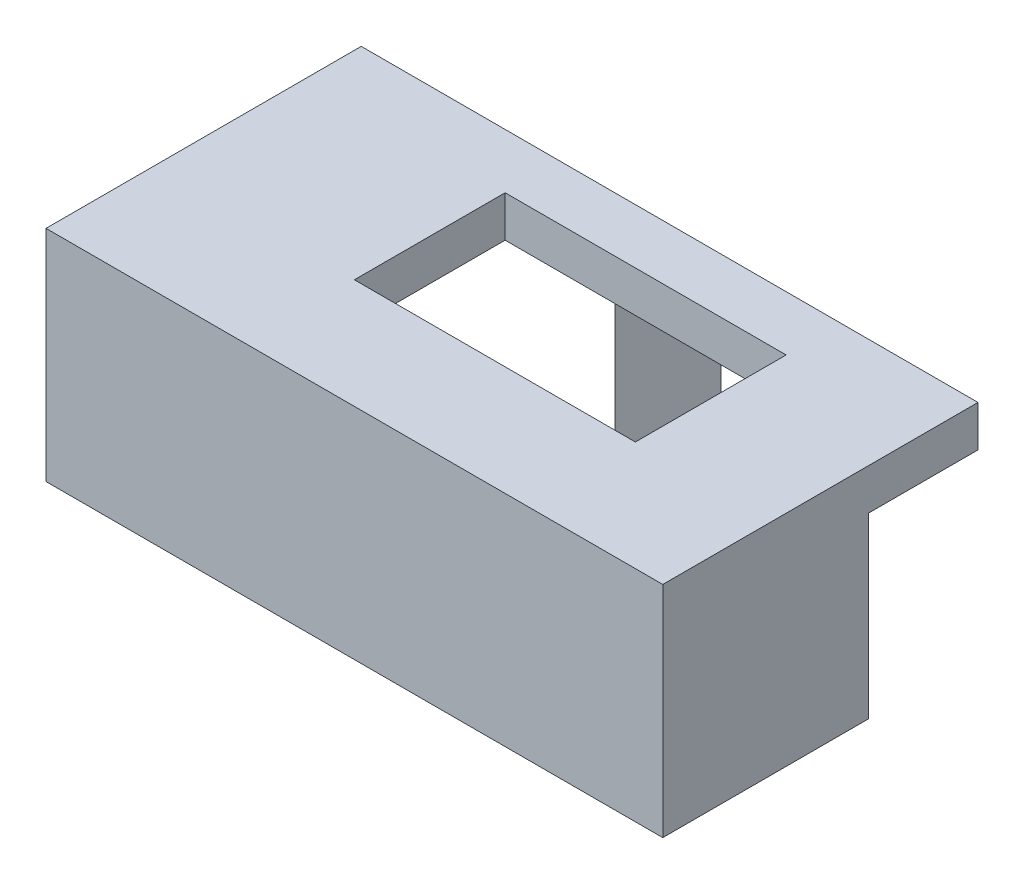
ISO-10303-21;
HEADER;
FILE_DESCRIPTION(('STEP AP214'),'2;1');
FILE_NAME('part.step','',(''),(''),'','','');
FILE_SCHEMA(('AUTOMOTIVE_DESIGN { 1 0 10303 214 1 1 1 1 }'));
ENDSEC;
DATA;
#1=APPLICATION_CONTEXT('core data for automotive mechanical design processes');
#2=APPLICATION_PROTOCOL_DEFINITION('international standard','automotive_design',2000,#1);
#3=PRODUCT_CONTEXT('',#1,'mechanical');
#4=PRODUCT('Part','Part','',(#3));
#5=PRODUCT_RELATED_PRODUCT_CATEGORY('part','',(#4));
#6=PRODUCT_DEFINITION_FORMATION('','',#4);
#7=PRODUCT_DEFINITION_CONTEXT('part definition',#1,'design');
#8=PRODUCT_DEFINITION('design','',#6,#7);
#9=PRODUCT_DEFINITION_SHAPE('','',#8);
#10=(LENGTH_UNIT() NAMED_UNIT(*) SI_UNIT(.MILLI.,.METRE.));
#11=(NAMED_UNIT(*) PLANE_ANGLE_UNIT() SI_UNIT($,.RADIAN.));
#12=(NAMED_UNIT(*) SI_UNIT($,.STERADIAN.) SOLID_ANGLE_UNIT());
#13=UNCERTAINTY_MEASURE_WITH_UNIT(LENGTH_MEASURE(1.E-05),#10,'distance_accuracy_value','');
#14=(GEOMETRIC_REPRESENTATION_CONTEXT(3) GLOBAL_UNCERTAINTY_ASSIGNED_CONTEXT((#13)) GLOBAL_UNIT_ASSIGNED_CONTEXT((#10,
#11,#12)) REPRESENTATION_CONTEXT('',''));
#15=CARTESIAN_POINT('',(0.,0.,0.));
#16=DIRECTION('',(0.,0.,1.));
#17=DIRECTION('',(1.,0.,0.));
#18=AXIS2_PLACEMENT_3D('',#15,#16,#17);
#19=CARTESIAN_POINT('',(0.,0.,0.));
#20=DIRECTION('',(0.,-1.,0.));
#21=DIRECTION('',(0.,0.,-1.));
#22=AXIS2_PLACEMENT_3D('',#19,#20,#21);
#23=PLANE('',#22);
#24=DIRECTION('',(-1.,0.,0.));
#25=VECTOR('',#24,1.);
#26=CARTESIAN_POINT('',(0.,0.,-46.));
#27=LINE('',#26,#25);
#28=CARTESIAN_POINT('',(37.5,0.,-46.));
#29=VERTEX_POINT('',#28);
#30=CARTESIAN_POINT('',(0.,0.,-46.));
#31=VERTEX_POINT('',#30);
#32=EDGE_CURVE('E190',#29,#31,#27,.T.);
#33=ORIENTED_EDGE('',*,*,#32,.F.);
#34=DIRECTION('',(-0.68394112888133,0.,-0.729537204140085));
#35=VECTOR('',#34,1.);
#36=CARTESIAN_POINT('',(45.,0.,-38.));
#37=LINE('',#36,#35);
#38=CARTESIAN_POINT('',(45.,0.,-38.));
#39=VERTEX_POINT('',#38);
#40=EDGE_CURVE('E61',#39,#29,#37,.T.);
#41=ORIENTED_EDGE('',*,*,#40,.F.);
#42=DIRECTION('',(-1.,0.,0.));
#43=VECTOR('',#42,1.);
#44=CARTESIAN_POINT('',(29.,0.,-38.));
#45=LINE('',#44,#43);
#46=CARTESIAN_POINT('',(29.,0.,-38.));
#47=VERTEX_POINT('',#46);
#48=EDGE_CURVE('E187',#39,#47,#45,.T.);
#49=ORIENTED_EDGE('',*,*,#48,.T.);
#50=DIRECTION('',(0.,0.,1.));
#51=VECTOR('',#50,1.);
#52=CARTESIAN_POINT('',(29.,0.,-16.));
#53=LINE('',#52,#51);
#54=CARTESIAN_POINT('',(29.,0.,-16.));
#55=VERTEX_POINT('',#54);
#56=EDGE_CURVE('E326',#47,#55,#53,.T.);
#57=ORIENTED_EDGE('',*,*,#56,.T.);
#58=DIRECTION('',(1.,0.,0.));
#59=VECTOR('',#58,1.);
#60=CARTESIAN_POINT('',(29.,0.,-16.));
#61=LINE('',#60,#59);
#62=CARTESIAN_POINT('',(70.,0.,-16.));
#63=VERTEX_POINT('',#62);
#64=EDGE_CURVE('E337',#55,#63,#61,.T.);
#65=ORIENTED_EDGE('',*,*,#64,.T.);
#66=DIRECTION('',(0.,0.,-1.));
#67=VECTOR('',#66,1.);
#68=CARTESIAN_POINT('',(70.,0.,-16.));
#69=LINE('',#68,#67);
#70=CARTESIAN_POINT('',(70.,0.,-38.));
#71=VERTEX_POINT('',#70);
#72=EDGE_CURVE('E203',#63,#71,#69,.T.);
#73=ORIENTED_EDGE('',*,*,#72,.T.);
#74=EDGE_CURVE('E198',#71,#39,#45,.T.);
#75=ORIENTED_EDGE('',*,*,#74,.T.);
#76=DIRECTION('',(-0.683941128881331,0.,0.729537204140084));
#77=VECTOR('',#76,1.);
#78=CARTESIAN_POINT('',(52.5,0.,-46.));
#79=LINE('',#78,#77);
#80=CARTESIAN_POINT('',(52.5,0.,-46.));
#81=VERTEX_POINT('',#80);
#82=EDGE_CURVE('E166',#81,#39,#79,.T.);
#83=ORIENTED_EDGE('',*,*,#82,.F.);
#84=CARTESIAN_POINT('',(90.,0.,-46.));
#85=VERTEX_POINT('',#84);
#86=EDGE_CURVE('E234',#85,#81,#27,.T.);
#87=ORIENTED_EDGE('',*,*,#86,.F.);
#88=DIRECTION('',(0.,0.,-1.));
#89=VECTOR('',#88,1.);
#90=CARTESIAN_POINT('',(90.,0.,0.));
#91=LINE('',#90,#89);
#92=CARTESIAN_POINT('',(90.,0.,-30.));
#93=VERTEX_POINT('',#92);
#94=EDGE_CURVE('E247',#93,#85,#91,.T.);
#95=ORIENTED_EDGE('',*,*,#94,.F.);
#96=DIRECTION('',(1.,0.,0.));
#97=VECTOR('',#96,1.);
#98=CARTESIAN_POINT('',(90.,0.,-30.));
#99=LINE('',#98,#97);
#100=CARTESIAN_POINT('',(86.,0.,-30.));
#101=VERTEX_POINT('',#100);
#102=EDGE_CURVE('E69',#101,#93,#99,.T.);
#103=ORIENTED_EDGE('',*,*,#102,.F.);
#104=DIRECTION('',(0.,0.,-1.));
#105=VECTOR('',#104,1.);
#106=CARTESIAN_POINT('',(86.,0.,-2.00000000000001));
#107=LINE('',#106,#105);
#108=CARTESIAN_POINT('',(86.,0.,-2.00000000000001));
#109=VERTEX_POINT('',#108);
#110=EDGE_CURVE('E302',#109,#101,#107,.T.);
#111=ORIENTED_EDGE('',*,*,#110,.F.);
#112=DIRECTION('',(1.,0.,0.));
#113=VECTOR('',#112,1.);
#114=CARTESIAN_POINT('',(4.,0.,-2.00000000000001));
#115=LINE('',#114,#113);
#116=CARTESIAN_POINT('',(4.,0.,-2.00000000000001));
#117=VERTEX_POINT('',#116);
#118=EDGE_CURVE('E298',#117,#109,#115,.T.);
#119=ORIENTED_EDGE('',*,*,#118,.F.);
#120=DIRECTION('',(0.,0.,1.));
#121=VECTOR('',#120,1.);
#122=CARTESIAN_POINT('',(4.,0.,-2.00000000000001));
#123=LINE('',#122,#121);
#124=CARTESIAN_POINT('',(4.,0.,-30.));
#125=VERTEX_POINT('',#124);
#126=EDGE_CURVE('E294',#125,#117,#123,.T.);
#127=ORIENTED_EDGE('',*,*,#126,.F.);
#128=DIRECTION('',(1.,0.,0.));
#129=VECTOR('',#128,1.);
#130=CARTESIAN_POINT('',(0.,0.,-30.));
#131=LINE('',#130,#129);
#132=CARTESIAN_POINT('',(0.,0.,-30.));
#133=VERTEX_POINT('',#132);
#134=EDGE_CURVE('E192',#133,#125,#131,.T.);
#135=ORIENTED_EDGE('',*,*,#134,.F.);
#136=DIRECTION('',(0.,0.,1.));
#137=VECTOR('',#136,1.);
#138=CARTESIAN_POINT('',(0.,0.,0.));
#139=LINE('',#138,#137);
#140=EDGE_CURVE('E228',#31,#133,#139,.T.);
#141=ORIENTED_EDGE('',*,*,#140,.F.);
#142=EDGE_LOOP('',(#33,#41,#49,#57,#65,#73,#75,#83,#87,#95,#103,#111,#119,#127,#135,#141));
#143=FACE_BOUND('',#142,.T.);
#144=ADVANCED_FACE('F45',(#143),#23,.T.);
#145=CARTESIAN_POINT('',(0.,6.,0.));
#146=DIRECTION('',(0.,-1.,0.));
#147=DIRECTION('',(0.,0.,-1.));
#148=AXIS2_PLACEMENT_3D('',#145,#146,#147);
#149=PLANE('',#148);
#150=DIRECTION('',(0.,0.,1.));
#151=VECTOR('',#150,1.);
#152=CARTESIAN_POINT('',(0.,6.,0.));
#153=LINE('',#152,#151);
#154=CARTESIAN_POINT('',(0.,6.,-46.));
#155=VERTEX_POINT('',#154);
#156=CARTESIAN_POINT('',(0.,6.,0.));
#157=VERTEX_POINT('',#156);
#158=EDGE_CURVE('E229',#155,#157,#153,.T.);
#159=ORIENTED_EDGE('',*,*,#158,.T.);
#160=DIRECTION('',(1.,0.,0.));
#161=VECTOR('',#160,1.);
#162=CARTESIAN_POINT('',(0.,6.,0.));
#163=LINE('',#162,#161);
#164=CARTESIAN_POINT('',(90.,6.,0.));
#165=VERTEX_POINT('',#164);
#166=EDGE_CURVE('E233',#157,#165,#163,.T.);
#167=ORIENTED_EDGE('',*,*,#166,.T.);
#168=DIRECTION('',(0.,0.,-1.));
#169=VECTOR('',#168,1.);
#170=CARTESIAN_POINT('',(90.,6.,0.));
#171=LINE('',#170,#169);
#172=CARTESIAN_POINT('',(90.,6.,-46.));
#173=VERTEX_POINT('',#172);
#174=EDGE_CURVE('E237',#165,#173,#171,.T.);
#175=ORIENTED_EDGE('',*,*,#174,.T.);
#176=DIRECTION('',(-1.,0.,0.));
#177=VECTOR('',#176,1.);
#178=CARTESIAN_POINT('',(0.,6.,-46.));
#179=LINE('',#178,#177);
#180=EDGE_CURVE('E240',#173,#155,#179,.T.);
#181=ORIENTED_EDGE('',*,*,#180,.T.);
#182=EDGE_LOOP('',(#159,#167,#175,#181));
#183=FACE_BOUND('',#182,.T.);
#184=DIRECTION('',(0.,0.,1.));
#185=VECTOR('',#184,1.);
#186=CARTESIAN_POINT('',(29.,6.,-16.));
#187=LINE('',#186,#185);
#188=CARTESIAN_POINT('',(29.,6.,-38.));
#189=VERTEX_POINT('',#188);
#190=CARTESIAN_POINT('',(29.,6.,-16.));
#191=VERTEX_POINT('',#190);
#192=EDGE_CURVE('E208',#189,#191,#187,.T.);
#193=ORIENTED_EDGE('',*,*,#192,.F.);
#194=DIRECTION('',(-1.,0.,0.));
#195=VECTOR('',#194,1.);
#196=CARTESIAN_POINT('',(29.,6.,-38.));
#197=LINE('',#196,#195);
#198=CARTESIAN_POINT('',(70.,6.,-38.));
#199=VERTEX_POINT('',#198);
#200=EDGE_CURVE('E218',#199,#189,#197,.T.);
#201=ORIENTED_EDGE('',*,*,#200,.F.);
#202=DIRECTION('',(0.,0.,-1.));
#203=VECTOR('',#202,1.);
#204=CARTESIAN_POINT('',(70.,6.,-16.));
#205=LINE('',#204,#203);
#206=CARTESIAN_POINT('',(70.,6.,-16.));
#207=VERTEX_POINT('',#206);
#208=EDGE_CURVE('E330',#207,#199,#205,.T.);
#209=ORIENTED_EDGE('',*,*,#208,.F.);
#210=DIRECTION('',(1.,0.,0.));
#211=VECTOR('',#210,1.);
#212=CARTESIAN_POINT('',(29.,6.,-16.));
#213=LINE('',#212,#211);
#214=EDGE_CURVE('E210',#191,#207,#213,.T.);
#215=ORIENTED_EDGE('',*,*,#214,.F.);
#216=EDGE_LOOP('',(#193,#201,#209,#215));
#217=FACE_BOUND('',#216,.T.);
#218=ADVANCED_FACE('F350',(#183,#217),#149,.F.);
#219=CARTESIAN_POINT('',(0.,6.,0.));
#220=DIRECTION('',(1.,0.,0.));
#221=DIRECTION('',(0.,0.,-1.));
#222=AXIS2_PLACEMENT_3D('',#219,#220,#221);
#223=PLANE('',#222);
#224=ORIENTED_EDGE('',*,*,#140,.T.);
#225=DIRECTION('',(0.,1.,0.));
#226=VECTOR('',#225,1.);
#227=CARTESIAN_POINT('',(0.,-26.,-30.));
#228=LINE('',#227,#226);
#229=CARTESIAN_POINT('',(0.,-26.,-30.));
#230=VERTEX_POINT('',#229);
#231=EDGE_CURVE('E323',#230,#133,#228,.T.);
#232=ORIENTED_EDGE('',*,*,#231,.F.);
#233=DIRECTION('',(0.,0.,-1.));
#234=VECTOR('',#233,1.);
#235=CARTESIAN_POINT('',(0.,-26.,0.));
#236=LINE('',#235,#234);
#237=CARTESIAN_POINT('',(0.,-26.,0.));
#238=VERTEX_POINT('',#237);
#239=EDGE_CURVE('E306',#238,#230,#236,.T.);
#240=ORIENTED_EDGE('',*,*,#239,.F.);
#241=DIRECTION('',(0.,-1.,0.));
#242=VECTOR('',#241,1.);
#243=CARTESIAN_POINT('',(0.,6.,0.));
#244=LINE('',#243,#242);
#245=EDGE_CURVE('E11',#157,#238,#244,.T.);
#246=ORIENTED_EDGE('',*,*,#245,.F.);
#247=ORIENTED_EDGE('',*,*,#158,.F.);
#248=DIRECTION('',(0.,-1.,0.));
#249=VECTOR('',#248,1.);
#250=CARTESIAN_POINT('',(0.,6.,-46.));
#251=LINE('',#250,#249);
#252=EDGE_CURVE('E243',#155,#31,#251,.T.);
#253=ORIENTED_EDGE('',*,*,#252,.T.);
#254=EDGE_LOOP('',(#224,#232,#240,#246,#247,#253));
#255=FACE_BOUND('',#254,.T.);
#256=ADVANCED_FACE('F47',(#255),#223,.F.);
#257=CARTESIAN_POINT('',(0.,6.,0.));
#258=DIRECTION('',(0.,0.,-1.));
#259=DIRECTION('',(-1.,0.,0.));
#260=AXIS2_PLACEMENT_3D('',#257,#258,#259);
#261=PLANE('',#260);
#262=ORIENTED_EDGE('',*,*,#245,.T.);
#263=DIRECTION('',(-1.,0.,0.));
#264=VECTOR('',#263,1.);
#265=CARTESIAN_POINT('',(90.,-26.,0.));
#266=LINE('',#265,#264);
#267=CARTESIAN_POINT('',(90.,-26.,0.));
#268=VERTEX_POINT('',#267);
#269=EDGE_CURVE('E274',#268,#238,#266,.T.);
#270=ORIENTED_EDGE('',*,*,#269,.F.);
#271=DIRECTION('',(0.,-1.,0.));
#272=VECTOR('',#271,1.);
#273=CARTESIAN_POINT('',(90.,6.,0.));
#274=LINE('',#273,#272);
#275=EDGE_CURVE('E54',#165,#268,#274,.T.);
#276=ORIENTED_EDGE('',*,*,#275,.F.);
#277=ORIENTED_EDGE('',*,*,#166,.F.);
#278=EDGE_LOOP('',(#262,#270,#276,#277));
#279=FACE_BOUND('',#278,.T.);
#280=ADVANCED_FACE('F281',(#279),#261,.F.);
#281=CARTESIAN_POINT('',(90.,6.,0.));
#282=DIRECTION('',(-1.,0.,0.));
#283=DIRECTION('',(0.,0.,1.));
#284=AXIS2_PLACEMENT_3D('',#281,#282,#283);
#285=PLANE('',#284);
#286=ORIENTED_EDGE('',*,*,#275,.T.);
#287=DIRECTION('',(0.,0.,1.));
#288=VECTOR('',#287,1.);
#289=CARTESIAN_POINT('',(90.,-26.,0.));
#290=LINE('',#289,#288);
#291=CARTESIAN_POINT('',(90.,-26.,-30.));
#292=VERTEX_POINT('',#291);
#293=EDGE_CURVE('E266',#292,#268,#290,.T.);
#294=ORIENTED_EDGE('',*,*,#293,.F.);
#295=DIRECTION('',(0.,1.,0.));
#296=VECTOR('',#295,1.);
#297=CARTESIAN_POINT('',(90.,-26.,-30.));
#298=LINE('',#297,#296);
#299=EDGE_CURVE('E284',#292,#93,#298,.T.);
#300=ORIENTED_EDGE('',*,*,#299,.T.);
#301=ORIENTED_EDGE('',*,*,#94,.T.);
#302=DIRECTION('',(0.,-1.,0.));
#303=VECTOR('',#302,1.);
#304=CARTESIAN_POINT('',(90.,6.,-46.));
#305=LINE('',#304,#303);
#306=EDGE_CURVE('E255',#173,#85,#305,.T.);
#307=ORIENTED_EDGE('',*,*,#306,.F.);
#308=ORIENTED_EDGE('',*,*,#174,.F.);
#309=EDGE_LOOP('',(#286,#294,#300,#301,#307,#308));
#310=FACE_BOUND('',#309,.T.);
#311=ADVANCED_FACE('F264',(#310),#285,.F.);
#312=CARTESIAN_POINT('',(0.,6.,-46.));
#313=DIRECTION('',(0.,0.,1.));
#314=DIRECTION('',(1.,0.,0.));
#315=AXIS2_PLACEMENT_3D('',#312,#313,#314);
#316=PLANE('',#315);
#317=ORIENTED_EDGE('',*,*,#86,.T.);
#318=DIRECTION('',(0.,1.,0.));
#319=VECTOR('',#318,1.);
#320=CARTESIAN_POINT('',(52.5,-26.,-46.));
#321=LINE('',#320,#319);
#322=CARTESIAN_POINT('',(52.5,-26.,-46.));
#323=VERTEX_POINT('',#322);
#324=EDGE_CURVE('E172',#323,#81,#321,.T.);
#325=ORIENTED_EDGE('',*,*,#324,.F.);
#326=DIRECTION('',(1.,0.,0.));
#327=VECTOR('',#326,1.);
#328=CARTESIAN_POINT('',(37.5,-26.,-46.));
#329=LINE('',#328,#327);
#330=CARTESIAN_POINT('',(37.5,-26.,-46.));
#331=VERTEX_POINT('',#330);
#332=EDGE_CURVE('E418',#331,#323,#329,.T.);
#333=ORIENTED_EDGE('',*,*,#332,.F.);
#334=DIRECTION('',(0.,1.,0.));
#335=VECTOR('',#334,1.);
#336=CARTESIAN_POINT('',(37.5,-26.,-46.));
#337=LINE('',#336,#335);
#338=EDGE_CURVE('E416',#331,#29,#337,.T.);
#339=ORIENTED_EDGE('',*,*,#338,.T.);
#340=ORIENTED_EDGE('',*,*,#32,.T.);
#341=ORIENTED_EDGE('',*,*,#252,.F.);
#342=ORIENTED_EDGE('',*,*,#180,.F.);
#343=ORIENTED_EDGE('',*,*,#306,.T.);
#344=EDGE_LOOP('',(#317,#325,#333,#339,#340,#341,#342,#343));
#345=FACE_BOUND('',#344,.T.);
#346=ADVANCED_FACE('F373',(#345),#316,.F.);
#347=CARTESIAN_POINT('',(29.,6.,-16.));
#348=DIRECTION('',(1.,0.,0.));
#349=DIRECTION('',(0.,0.,-1.));
#350=AXIS2_PLACEMENT_3D('',#347,#348,#349);
#351=PLANE('',#350);
#352=ORIENTED_EDGE('',*,*,#56,.F.);
#353=DIRECTION('',(0.,-1.,0.));
#354=VECTOR('',#353,1.);
#355=CARTESIAN_POINT('',(29.,6.,-38.));
#356=LINE('',#355,#354);
#357=EDGE_CURVE('E201',#189,#47,#356,.T.);
#358=ORIENTED_EDGE('',*,*,#357,.F.);
#359=ORIENTED_EDGE('',*,*,#192,.T.);
#360=DIRECTION('',(0.,-1.,0.));
#361=VECTOR('',#360,1.);
#362=CARTESIAN_POINT('',(29.,6.,-16.));
#363=LINE('',#362,#361);
#364=EDGE_CURVE('E224',#191,#55,#363,.T.);
#365=ORIENTED_EDGE('',*,*,#364,.T.);
#366=EDGE_LOOP('',(#352,#358,#359,#365));
#367=FACE_BOUND('',#366,.T.);
#368=ADVANCED_FACE('F346',(#367),#351,.T.);
#369=CARTESIAN_POINT('',(29.,6.,-16.));
#370=DIRECTION('',(0.,0.,-1.));
#371=DIRECTION('',(-1.,0.,0.));
#372=AXIS2_PLACEMENT_3D('',#369,#370,#371);
#373=PLANE('',#372);
#374=ORIENTED_EDGE('',*,*,#64,.F.);
#375=ORIENTED_EDGE('',*,*,#364,.F.);
#376=ORIENTED_EDGE('',*,*,#214,.T.);
#377=DIRECTION('',(0.,-1.,0.));
#378=VECTOR('',#377,1.);
#379=CARTESIAN_POINT('',(70.,6.,-16.));
#380=LINE('',#379,#378);
#381=EDGE_CURVE('E221',#207,#63,#380,.T.);
#382=ORIENTED_EDGE('',*,*,#381,.T.);
#383=EDGE_LOOP('',(#374,#375,#376,#382));
#384=FACE_BOUND('',#383,.T.);
#385=ADVANCED_FACE('F342',(#384),#373,.T.);
#386=CARTESIAN_POINT('',(70.,6.,-16.));
#387=DIRECTION('',(-1.,0.,0.));
#388=DIRECTION('',(0.,0.,1.));
#389=AXIS2_PLACEMENT_3D('',#386,#387,#388);
#390=PLANE('',#389);
#391=ORIENTED_EDGE('',*,*,#72,.F.);
#392=ORIENTED_EDGE('',*,*,#381,.F.);
#393=ORIENTED_EDGE('',*,*,#208,.T.);
#394=DIRECTION('',(0.,-1.,0.));
#395=VECTOR('',#394,1.);
#396=CARTESIAN_POINT('',(70.,6.,-38.));
#397=LINE('',#396,#395);
#398=EDGE_CURVE('E217',#199,#71,#397,.T.);
#399=ORIENTED_EDGE('',*,*,#398,.T.);
#400=EDGE_LOOP('',(#391,#392,#393,#399));
#401=FACE_BOUND('',#400,.T.);
#402=ADVANCED_FACE('F353',(#401),#390,.T.);
#403=CARTESIAN_POINT('',(29.,6.,-38.));
#404=DIRECTION('',(0.,0.,1.));
#405=DIRECTION('',(1.,0.,0.));
#406=AXIS2_PLACEMENT_3D('',#403,#404,#405);
#407=PLANE('',#406);
#408=ORIENTED_EDGE('',*,*,#74,.F.);
#409=ORIENTED_EDGE('',*,*,#398,.F.);
#410=ORIENTED_EDGE('',*,*,#200,.T.);
#411=ORIENTED_EDGE('',*,*,#357,.T.);
#412=ORIENTED_EDGE('',*,*,#48,.F.);
#413=EDGE_LOOP('',(#408,#409,#410,#411,#412));
#414=FACE_BOUND('',#413,.T.);
#415=ADVANCED_FACE('F197',(#414),#407,.T.);
#416=CARTESIAN_POINT('',(0.,-26.,-30.));
#417=DIRECTION('',(0.,0.,1.));
#418=DIRECTION('',(1.,0.,0.));
#419=AXIS2_PLACEMENT_3D('',#416,#417,#418);
#420=PLANE('',#419);
#421=ORIENTED_EDGE('',*,*,#134,.T.);
#422=DIRECTION('',(0.,1.,0.));
#423=VECTOR('',#422,1.);
#424=CARTESIAN_POINT('',(4.,-26.,-30.));
#425=LINE('',#424,#423);
#426=CARTESIAN_POINT('',(4.,-26.,-30.));
#427=VERTEX_POINT('',#426);
#428=EDGE_CURVE('E319',#427,#125,#425,.T.);
#429=ORIENTED_EDGE('',*,*,#428,.F.);
#430=DIRECTION('',(1.,0.,0.));
#431=VECTOR('',#430,1.);
#432=CARTESIAN_POINT('',(0.,-26.,-30.));
#433=LINE('',#432,#431);
#434=EDGE_CURVE('E389',#230,#427,#433,.T.);
#435=ORIENTED_EDGE('',*,*,#434,.F.);
#436=ORIENTED_EDGE('',*,*,#231,.T.);
#437=EDGE_LOOP('',(#421,#429,#435,#436));
#438=FACE_BOUND('',#437,.T.);
#439=ADVANCED_FACE('F361',(#438),#420,.F.);
#440=CARTESIAN_POINT('',(4.,-26.,-2.00000000000001));
#441=DIRECTION('',(-1.,0.,0.));
#442=DIRECTION('',(0.,0.,1.));
#443=AXIS2_PLACEMENT_3D('',#440,#441,#442);
#444=PLANE('',#443);
#445=ORIENTED_EDGE('',*,*,#126,.T.);
#446=DIRECTION('',(0.,1.,0.));
#447=VECTOR('',#446,1.);
#448=CARTESIAN_POINT('',(4.,-26.,-2.00000000000001));
#449=LINE('',#448,#447);
#450=CARTESIAN_POINT('',(4.,-26.,-2.00000000000001));
#451=VERTEX_POINT('',#450);
#452=EDGE_CURVE('E315',#451,#117,#449,.T.);
#453=ORIENTED_EDGE('',*,*,#452,.F.);
#454=DIRECTION('',(0.,0.,1.));
#455=VECTOR('',#454,1.);
#456=CARTESIAN_POINT('',(4.,-26.,-2.00000000000001));
#457=LINE('',#456,#455);
#458=EDGE_CURVE('E392',#427,#451,#457,.T.);
#459=ORIENTED_EDGE('',*,*,#458,.F.);
#460=ORIENTED_EDGE('',*,*,#428,.T.);
#461=EDGE_LOOP('',(#445,#453,#459,#460));
#462=FACE_BOUND('',#461,.T.);
#463=ADVANCED_FACE('F446',(#462),#444,.F.);
#464=CARTESIAN_POINT('',(4.,-26.,-2.00000000000001));
#465=DIRECTION('',(0.,0.,1.));
#466=DIRECTION('',(1.,0.,0.));
#467=AXIS2_PLACEMENT_3D('',#464,#465,#466);
#468=PLANE('',#467);
#469=ORIENTED_EDGE('',*,*,#118,.T.);
#470=DIRECTION('',(0.,1.,0.));
#471=VECTOR('',#470,1.);
#472=CARTESIAN_POINT('',(86.,-26.,-2.00000000000001));
#473=LINE('',#472,#471);
#474=CARTESIAN_POINT('',(86.,-26.,-2.00000000000001));
#475=VERTEX_POINT('',#474);
#476=EDGE_CURVE('E311',#475,#109,#473,.T.);
#477=ORIENTED_EDGE('',*,*,#476,.F.);
#478=DIRECTION('',(1.,0.,0.));
#479=VECTOR('',#478,1.);
#480=CARTESIAN_POINT('',(4.,-26.,-2.00000000000001));
#481=LINE('',#480,#479);
#482=EDGE_CURVE('E401',#451,#475,#481,.T.);
#483=ORIENTED_EDGE('',*,*,#482,.F.);
#484=ORIENTED_EDGE('',*,*,#452,.T.);
#485=EDGE_LOOP('',(#469,#477,#483,#484));
#486=FACE_BOUND('',#485,.T.);
#487=ADVANCED_FACE('F443',(#486),#468,.F.);
#488=CARTESIAN_POINT('',(86.,-26.,-2.00000000000001));
#489=DIRECTION('',(1.,0.,0.));
#490=DIRECTION('',(0.,0.,-1.));
#491=AXIS2_PLACEMENT_3D('',#488,#489,#490);
#492=PLANE('',#491);
#493=ORIENTED_EDGE('',*,*,#110,.T.);
#494=DIRECTION('',(0.,1.,0.));
#495=VECTOR('',#494,1.);
#496=CARTESIAN_POINT('',(86.,-26.,-30.));
#497=LINE('',#496,#495);
#498=CARTESIAN_POINT('',(86.,-26.,-30.));
#499=VERTEX_POINT('',#498);
#500=EDGE_CURVE('E287',#499,#101,#497,.T.);
#501=ORIENTED_EDGE('',*,*,#500,.F.);
#502=DIRECTION('',(0.,0.,-1.));
#503=VECTOR('',#502,1.);
#504=CARTESIAN_POINT('',(86.,-26.,-2.00000000000001));
#505=LINE('',#504,#503);
#506=EDGE_CURVE('E404',#475,#499,#505,.T.);
#507=ORIENTED_EDGE('',*,*,#506,.F.);
#508=ORIENTED_EDGE('',*,*,#476,.T.);
#509=EDGE_LOOP('',(#493,#501,#507,#508));
#510=FACE_BOUND('',#509,.T.);
#511=ADVANCED_FACE('F412',(#510),#492,.F.);
#512=CARTESIAN_POINT('',(90.,-26.,-30.));
#513=DIRECTION('',(0.,0.,1.));
#514=DIRECTION('',(1.,0.,0.));
#515=AXIS2_PLACEMENT_3D('',#512,#513,#514);
#516=PLANE('',#515);
#517=ORIENTED_EDGE('',*,*,#102,.T.);
#518=ORIENTED_EDGE('',*,*,#299,.F.);
#519=DIRECTION('',(1.,0.,0.));
#520=VECTOR('',#519,1.);
#521=CARTESIAN_POINT('',(90.,-26.,-30.));
#522=LINE('',#521,#520);
#523=EDGE_CURVE('E277',#499,#292,#522,.T.);
#524=ORIENTED_EDGE('',*,*,#523,.F.);
#525=ORIENTED_EDGE('',*,*,#500,.T.);
#526=EDGE_LOOP('',(#517,#518,#524,#525));
#527=FACE_BOUND('',#526,.T.);
#528=ADVANCED_FACE('F414',(#527),#516,.F.);
#529=CARTESIAN_POINT('',(0.,-26.,0.));
#530=DIRECTION('',(0.,-1.,0.));
#531=DIRECTION('',(0.,0.,-1.));
#532=AXIS2_PLACEMENT_3D('',#529,#530,#531);
#533=PLANE('',#532);
#534=ORIENTED_EDGE('',*,*,#239,.T.);
#535=ORIENTED_EDGE('',*,*,#434,.T.);
#536=ORIENTED_EDGE('',*,*,#458,.T.);
#537=ORIENTED_EDGE('',*,*,#482,.T.);
#538=ORIENTED_EDGE('',*,*,#506,.T.);
#539=ORIENTED_EDGE('',*,*,#523,.T.);
#540=ORIENTED_EDGE('',*,*,#293,.T.);
#541=ORIENTED_EDGE('',*,*,#269,.T.);
#542=EDGE_LOOP('',(#534,#535,#536,#537,#538,#539,#540,#541));
#543=FACE_BOUND('',#542,.T.);
#544=ADVANCED_FACE('F273',(#543),#533,.T.);
#545=CARTESIAN_POINT('',(45.,-26.,-38.));
#546=DIRECTION('',(0.729537204140085,0.,-0.68394112888133));
#547=DIRECTION('',(-0.68394112888133,0.,-0.729537204140085));
#548=AXIS2_PLACEMENT_3D('',#545,#546,#547);
#549=PLANE('',#548);
#550=ORIENTED_EDGE('',*,*,#40,.T.);
#551=ORIENTED_EDGE('',*,*,#338,.F.);
#552=DIRECTION('',(-0.68394112888133,0.,-0.729537204140085));
#553=VECTOR('',#552,1.);
#554=CARTESIAN_POINT('',(45.,-26.,-38.));
#555=LINE('',#554,#553);
#556=CARTESIAN_POINT('',(45.,-26.,-38.));
#557=VERTEX_POINT('',#556);
#558=EDGE_CURVE('E177',#557,#331,#555,.T.);
#559=ORIENTED_EDGE('',*,*,#558,.F.);
#560=DIRECTION('',(0.,1.,0.));
#561=VECTOR('',#560,1.);
#562=CARTESIAN_POINT('',(45.,-26.,-38.));
#563=LINE('',#562,#561);
#564=EDGE_CURVE('E169',#557,#39,#563,.T.);
#565=ORIENTED_EDGE('',*,*,#564,.T.);
#566=EDGE_LOOP('',(#550,#551,#559,#565));
#567=FACE_BOUND('',#566,.T.);
#568=ADVANCED_FACE('F179',(#567),#549,.F.);
#569=CARTESIAN_POINT('',(52.5,-26.,-46.));
#570=DIRECTION('',(-0.729537204140084,0.,-0.683941128881331));
#571=DIRECTION('',(-0.683941128881331,0.,0.729537204140084));
#572=AXIS2_PLACEMENT_3D('',#569,#570,#571);
#573=PLANE('',#572);
#574=ORIENTED_EDGE('',*,*,#82,.T.);
#575=ORIENTED_EDGE('',*,*,#564,.F.);
#576=DIRECTION('',(-0.683941128881331,0.,0.729537204140084));
#577=VECTOR('',#576,1.);
#578=CARTESIAN_POINT('',(52.5,-26.,-46.));
#579=LINE('',#578,#577);
#580=EDGE_CURVE('E182',#323,#557,#579,.T.);
#581=ORIENTED_EDGE('',*,*,#580,.F.);
#582=ORIENTED_EDGE('',*,*,#324,.T.);
#583=EDGE_LOOP('',(#574,#575,#581,#582));
#584=FACE_BOUND('',#583,.T.);
#585=ADVANCED_FACE('F167',(#584),#573,.F.);
#586=CARTESIAN_POINT('',(0.,-26.,0.));
#587=DIRECTION('',(0.,1.,0.));
#588=DIRECTION('',(0.,0.,1.));
#589=AXIS2_PLACEMENT_3D('',#586,#587,#588);
#590=PLANE('',#589);
#591=ORIENTED_EDGE('',*,*,#558,.T.);
#592=ORIENTED_EDGE('',*,*,#332,.T.);
#593=ORIENTED_EDGE('',*,*,#580,.T.);
#594=EDGE_LOOP('',(#591,#592,#593));
#595=FACE_BOUND('',#594,.T.);
#596=ADVANCED_FACE('F428',(#595),#590,.F.);
#597=CLOSED_SHELL('',(#144,#218,#256,#280,#311,#346,#368,#385,#402,#415,#439,#463,#487,#511,
#528,#544,#568,#585,#596));
#598=MANIFOLD_SOLID_BREP('B2',#597);
#599=ADVANCED_BREP_SHAPE_REPRESENTATION('',(#18,#598),#14);
#600=SHAPE_DEFINITION_REPRESENTATION(#9,#599);
ENDSEC;
END-ISO-10303-21;
